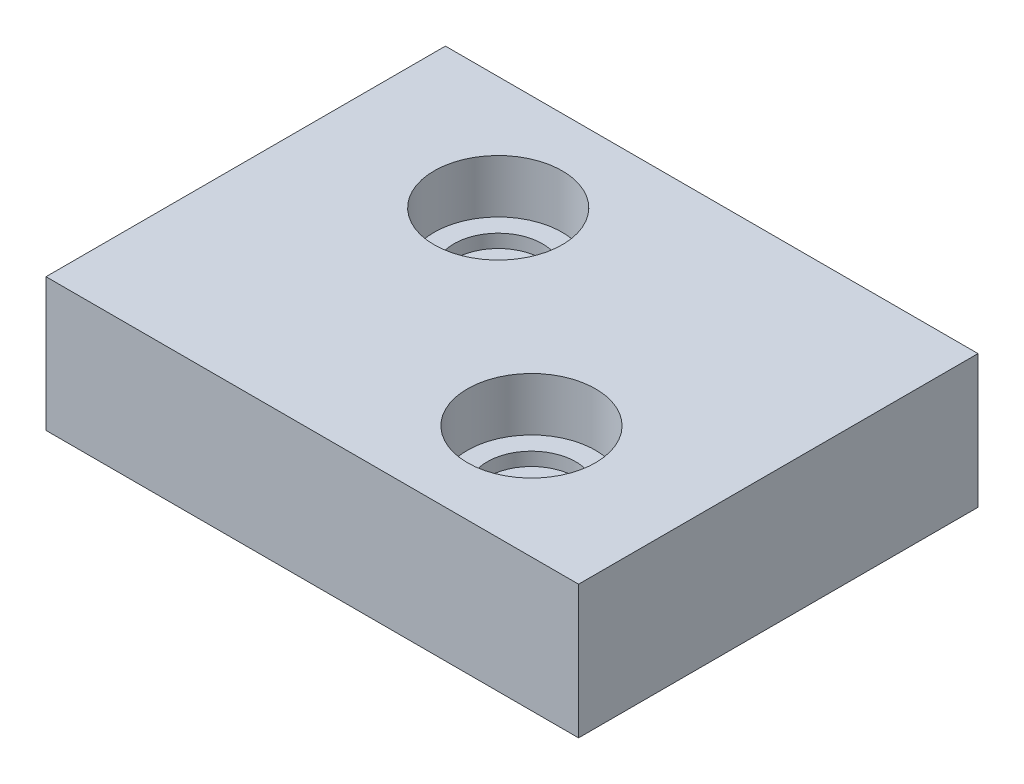
ISO-10303-21;
HEADER;
FILE_DESCRIPTION(('STEP AP214'),'2;1');
FILE_NAME('part.step','',(''),(''),'','','');
FILE_SCHEMA(('AUTOMOTIVE_DESIGN { 1 0 10303 214 1 1 1 1 }'));
ENDSEC;
DATA;
#1=APPLICATION_CONTEXT('core data for automotive mechanical design processes');
#2=APPLICATION_PROTOCOL_DEFINITION('international standard','automotive_design',2000,#1);
#3=PRODUCT_CONTEXT('',#1,'mechanical');
#4=PRODUCT('Part','Part','',(#3));
#5=PRODUCT_RELATED_PRODUCT_CATEGORY('part','',(#4));
#6=PRODUCT_DEFINITION_FORMATION('','',#4);
#7=PRODUCT_DEFINITION_CONTEXT('part definition',#1,'design');
#8=PRODUCT_DEFINITION('design','',#6,#7);
#9=PRODUCT_DEFINITION_SHAPE('','',#8);
#10=(LENGTH_UNIT() NAMED_UNIT(*) SI_UNIT(.MILLI.,.METRE.));
#11=(NAMED_UNIT(*) PLANE_ANGLE_UNIT() SI_UNIT($,.RADIAN.));
#12=(NAMED_UNIT(*) SI_UNIT($,.STERADIAN.) SOLID_ANGLE_UNIT());
#13=UNCERTAINTY_MEASURE_WITH_UNIT(LENGTH_MEASURE(1.E-05),#10,'distance_accuracy_value','');
#14=(GEOMETRIC_REPRESENTATION_CONTEXT(3) GLOBAL_UNCERTAINTY_ASSIGNED_CONTEXT((#13)) GLOBAL_UNIT_ASSIGNED_CONTEXT((#10,
#11,#12)) REPRESENTATION_CONTEXT('',''));
#15=CARTESIAN_POINT('',(0.,0.,0.));
#16=DIRECTION('',(0.,0.,1.));
#17=DIRECTION('',(1.,0.,0.));
#18=AXIS2_PLACEMENT_3D('',#15,#16,#17);
#19=CARTESIAN_POINT('',(20.,10.,15.));
#20=DIRECTION('',(-1.,0.,0.));
#21=DIRECTION('',(0.,0.,1.));
#22=AXIS2_PLACEMENT_3D('',#19,#20,#21);
#23=PLANE('',#22);
#24=DIRECTION('',(0.,0.,-1.));
#25=VECTOR('',#24,1.);
#26=CARTESIAN_POINT('',(20.,0.,15.));
#27=LINE('',#26,#25);
#28=CARTESIAN_POINT('',(20.,0.,15.));
#29=VERTEX_POINT('',#28);
#30=CARTESIAN_POINT('',(20.,0.,-15.));
#31=VERTEX_POINT('',#30);
#32=EDGE_CURVE('E111',#29,#31,#27,.T.);
#33=ORIENTED_EDGE('',*,*,#32,.T.);
#34=DIRECTION('',(0.,-1.,0.));
#35=VECTOR('',#34,1.);
#36=CARTESIAN_POINT('',(20.,10.,-15.));
#37=LINE('',#36,#35);
#38=CARTESIAN_POINT('',(20.,10.,-15.));
#39=VERTEX_POINT('',#38);
#40=EDGE_CURVE('E11',#39,#31,#37,.T.);
#41=ORIENTED_EDGE('',*,*,#40,.F.);
#42=DIRECTION('',(0.,0.,-1.));
#43=VECTOR('',#42,1.);
#44=CARTESIAN_POINT('',(20.,10.,15.));
#45=LINE('',#44,#43);
#46=CARTESIAN_POINT('',(20.,10.,15.));
#47=VERTEX_POINT('',#46);
#48=EDGE_CURVE('E95',#47,#39,#45,.T.);
#49=ORIENTED_EDGE('',*,*,#48,.F.);
#50=DIRECTION('',(0.,-1.,0.));
#51=VECTOR('',#50,1.);
#52=CARTESIAN_POINT('',(20.,10.,15.));
#53=LINE('',#52,#51);
#54=EDGE_CURVE('E107',#47,#29,#53,.T.);
#55=ORIENTED_EDGE('',*,*,#54,.T.);
#56=EDGE_LOOP('',(#33,#41,#49,#55));
#57=FACE_BOUND('',#56,.T.);
#58=ADVANCED_FACE('F43',(#57),#23,.F.);
#59=CARTESIAN_POINT('',(-20.,10.,-15.));
#60=DIRECTION('',(0.,0.,1.));
#61=DIRECTION('',(1.,0.,0.));
#62=AXIS2_PLACEMENT_3D('',#59,#60,#61);
#63=PLANE('',#62);
#64=DIRECTION('',(-1.,0.,0.));
#65=VECTOR('',#64,1.);
#66=CARTESIAN_POINT('',(-20.,0.,-15.));
#67=LINE('',#66,#65);
#68=CARTESIAN_POINT('',(-20.,0.,-15.));
#69=VERTEX_POINT('',#68);
#70=EDGE_CURVE('E100',#31,#69,#67,.T.);
#71=ORIENTED_EDGE('',*,*,#70,.T.);
#72=DIRECTION('',(0.,-1.,0.));
#73=VECTOR('',#72,1.);
#74=CARTESIAN_POINT('',(-20.,10.,-15.));
#75=LINE('',#74,#73);
#76=CARTESIAN_POINT('',(-20.,10.,-15.));
#77=VERTEX_POINT('',#76);
#78=EDGE_CURVE('E52',#77,#69,#75,.T.);
#79=ORIENTED_EDGE('',*,*,#78,.F.);
#80=DIRECTION('',(-1.,0.,0.));
#81=VECTOR('',#80,1.);
#82=CARTESIAN_POINT('',(-20.,10.,-15.));
#83=LINE('',#82,#81);
#84=EDGE_CURVE('E90',#39,#77,#83,.T.);
#85=ORIENTED_EDGE('',*,*,#84,.F.);
#86=ORIENTED_EDGE('',*,*,#40,.T.);
#87=EDGE_LOOP('',(#71,#79,#85,#86));
#88=FACE_BOUND('',#87,.T.);
#89=ADVANCED_FACE('F99',(#88),#63,.F.);
#90=CARTESIAN_POINT('',(-20.,10.,15.));
#91=DIRECTION('',(1.,0.,0.));
#92=DIRECTION('',(0.,0.,-1.));
#93=AXIS2_PLACEMENT_3D('',#90,#91,#92);
#94=PLANE('',#93);
#95=DIRECTION('',(0.,0.,1.));
#96=VECTOR('',#95,1.);
#97=CARTESIAN_POINT('',(-20.,0.,15.));
#98=LINE('',#97,#96);
#99=CARTESIAN_POINT('',(-20.,0.,15.));
#100=VERTEX_POINT('',#99);
#101=EDGE_CURVE('E77',#69,#100,#98,.T.);
#102=ORIENTED_EDGE('',*,*,#101,.T.);
#103=DIRECTION('',(0.,-1.,0.));
#104=VECTOR('',#103,1.);
#105=CARTESIAN_POINT('',(-20.,10.,15.));
#106=LINE('',#105,#104);
#107=CARTESIAN_POINT('',(-20.,10.,15.));
#108=VERTEX_POINT('',#107);
#109=EDGE_CURVE('E102',#108,#100,#106,.T.);
#110=ORIENTED_EDGE('',*,*,#109,.F.);
#111=DIRECTION('',(0.,0.,1.));
#112=VECTOR('',#111,1.);
#113=CARTESIAN_POINT('',(-20.,10.,15.));
#114=LINE('',#113,#112);
#115=EDGE_CURVE('E93',#77,#108,#114,.T.);
#116=ORIENTED_EDGE('',*,*,#115,.F.);
#117=ORIENTED_EDGE('',*,*,#78,.T.);
#118=EDGE_LOOP('',(#102,#110,#116,#117));
#119=FACE_BOUND('',#118,.T.);
#120=ADVANCED_FACE('F103',(#119),#94,.F.);
#121=CARTESIAN_POINT('',(-20.,10.,15.));
#122=DIRECTION('',(0.,0.,-1.));
#123=DIRECTION('',(-1.,0.,0.));
#124=AXIS2_PLACEMENT_3D('',#121,#122,#123);
#125=PLANE('',#124);
#126=DIRECTION('',(1.,0.,0.));
#127=VECTOR('',#126,1.);
#128=CARTESIAN_POINT('',(-20.,0.,15.));
#129=LINE('',#128,#127);
#130=EDGE_CURVE('E83',#100,#29,#129,.T.);
#131=ORIENTED_EDGE('',*,*,#130,.T.);
#132=ORIENTED_EDGE('',*,*,#54,.F.);
#133=DIRECTION('',(1.,0.,0.));
#134=VECTOR('',#133,1.);
#135=CARTESIAN_POINT('',(-20.,10.,15.));
#136=LINE('',#135,#134);
#137=EDGE_CURVE('E60',#108,#47,#136,.T.);
#138=ORIENTED_EDGE('',*,*,#137,.F.);
#139=ORIENTED_EDGE('',*,*,#109,.T.);
#140=EDGE_LOOP('',(#131,#132,#138,#139));
#141=FACE_BOUND('',#140,.T.);
#142=ADVANCED_FACE('F125',(#141),#125,.F.);
#143=CARTESIAN_POINT('',(0.,10.,0.));
#144=DIRECTION('',(0.,-1.,0.));
#145=DIRECTION('',(0.,0.,-1.));
#146=AXIS2_PLACEMENT_3D('',#143,#144,#145);
#147=PLANE('',#146);
#148=CARTESIAN_POINT('',(7.9286,10.,6.465));
#149=DIRECTION('',(0.,1.,0.));
#150=DIRECTION('',(0.,0.,1.));
#151=AXIS2_PLACEMENT_3D('',#148,#149,#150);
#152=CIRCLE('',#151,4.8125);
#153=CARTESIAN_POINT('',(7.9286,10.,11.2775));
#154=VERTEX_POINT('',#153);
#155=EDGE_CURVE('E173',#154,#154,#152,.T.);
#156=ORIENTED_EDGE('',*,*,#155,.F.);
#157=EDGE_LOOP('',(#156));
#158=FACE_BOUND('',#157,.T.);
#159=CARTESIAN_POINT('',(-7.5,10.,-6.4636));
#160=DIRECTION('',(0.,1.,0.));
#161=DIRECTION('',(0.,0.,1.));
#162=AXIS2_PLACEMENT_3D('',#159,#160,#161);
#163=CIRCLE('',#162,4.8125);
#164=CARTESIAN_POINT('',(-7.5,10.,-1.6511));
#165=VERTEX_POINT('',#164);
#166=EDGE_CURVE('E168',#165,#165,#163,.T.);
#167=ORIENTED_EDGE('',*,*,#166,.F.);
#168=EDGE_LOOP('',(#167));
#169=FACE_BOUND('',#168,.T.);
#170=ORIENTED_EDGE('',*,*,#48,.T.);
#171=ORIENTED_EDGE('',*,*,#84,.T.);
#172=ORIENTED_EDGE('',*,*,#115,.T.);
#173=ORIENTED_EDGE('',*,*,#137,.T.);
#174=EDGE_LOOP('',(#170,#171,#172,#173));
#175=FACE_BOUND('',#174,.T.);
#176=ADVANCED_FACE('F91',(#158,#169,#175),#147,.F.);
#177=CARTESIAN_POINT('',(0.,0.,0.));
#178=DIRECTION('',(0.,-1.,0.));
#179=DIRECTION('',(0.,0.,-1.));
#180=AXIS2_PLACEMENT_3D('',#177,#178,#179);
#181=PLANE('',#180);
#182=CARTESIAN_POINT('',(-13.3333333333333,0.,10.));
#183=DIRECTION('',(0.,-1.,0.));
#184=DIRECTION('',(0.,0.,1.));
#185=AXIS2_PLACEMENT_3D('',#182,#183,#184);
#186=CIRCLE('',#185,1.55);
#187=CARTESIAN_POINT('',(-13.3333333333333,0.,11.55));
#188=VERTEX_POINT('',#187);
#189=EDGE_CURVE('E136',#188,#188,#186,.T.);
#190=ORIENTED_EDGE('',*,*,#189,.F.);
#191=EDGE_LOOP('',(#190));
#192=FACE_BOUND('',#191,.T.);
#193=CARTESIAN_POINT('',(13.3333333333333,0.,-10.));
#194=DIRECTION('',(0.,-1.,0.));
#195=DIRECTION('',(0.,0.,1.));
#196=AXIS2_PLACEMENT_3D('',#193,#194,#195);
#197=CIRCLE('',#196,1.55);
#198=CARTESIAN_POINT('',(13.3333333333333,0.,-8.45));
#199=VERTEX_POINT('',#198);
#200=EDGE_CURVE('E144',#199,#199,#197,.T.);
#201=ORIENTED_EDGE('',*,*,#200,.F.);
#202=EDGE_LOOP('',(#201));
#203=FACE_BOUND('',#202,.T.);
#204=CARTESIAN_POINT('',(-13.3333333333333,0.,-9.99999999999999));
#205=DIRECTION('',(0.,-1.,0.));
#206=DIRECTION('',(0.,0.,-1.));
#207=AXIS2_PLACEMENT_3D('',#204,#205,#206);
#208=CIRCLE('',#207,1.55);
#209=CARTESIAN_POINT('',(-13.3333333333333,0.,-11.55));
#210=VERTEX_POINT('',#209);
#211=EDGE_CURVE('E145',#210,#210,#208,.T.);
#212=ORIENTED_EDGE('',*,*,#211,.F.);
#213=EDGE_LOOP('',(#212));
#214=FACE_BOUND('',#213,.T.);
#215=CARTESIAN_POINT('',(13.3333333333333,0.,10.));
#216=DIRECTION('',(0.,-1.,0.));
#217=DIRECTION('',(0.,0.,-1.));
#218=AXIS2_PLACEMENT_3D('',#215,#216,#217);
#219=CIRCLE('',#218,1.55);
#220=CARTESIAN_POINT('',(13.3333333333333,0.,8.45));
#221=VERTEX_POINT('',#220);
#222=EDGE_CURVE('E132',#221,#221,#219,.T.);
#223=ORIENTED_EDGE('',*,*,#222,.F.);
#224=EDGE_LOOP('',(#223));
#225=FACE_BOUND('',#224,.T.);
#226=ORIENTED_EDGE('',*,*,#32,.F.);
#227=ORIENTED_EDGE('',*,*,#130,.F.);
#228=ORIENTED_EDGE('',*,*,#101,.F.);
#229=ORIENTED_EDGE('',*,*,#70,.F.);
#230=EDGE_LOOP('',(#226,#227,#228,#229));
#231=FACE_BOUND('',#230,.T.);
#232=ADVANCED_FACE('F128',(#192,#203,#214,#225,#231),#181,.T.);
#233=CARTESIAN_POINT('',(13.3333333333333,4.,10.));
#234=DIRECTION('',(0.,-1.,0.));
#235=DIRECTION('',(0.,0.,-1.));
#236=AXIS2_PLACEMENT_3D('',#233,#234,#235);
#237=CYLINDRICAL_SURFACE('',#236,1.55);
#238=CARTESIAN_POINT('',(13.3333333333333,4.,10.));
#239=DIRECTION('',(0.,-1.,0.));
#240=DIRECTION('',(0.,0.,-1.));
#241=AXIS2_PLACEMENT_3D('',#238,#239,#240);
#242=CIRCLE('',#241,1.55);
#243=CARTESIAN_POINT('',(13.3333333333333,4.,8.45));
#244=VERTEX_POINT('',#243);
#245=EDGE_CURVE('E115',#244,#244,#242,.T.);
#246=ORIENTED_EDGE('',*,*,#245,.F.);
#247=EDGE_LOOP('',(#246));
#248=FACE_BOUND('',#247,.T.);
#249=ORIENTED_EDGE('',*,*,#222,.T.);
#250=EDGE_LOOP('',(#249));
#251=FACE_BOUND('',#250,.T.);
#252=ADVANCED_FACE('F249',(#248,#251),#237,.F.);
#253=CARTESIAN_POINT('',(13.3333333333333,4.,10.));
#254=DIRECTION('',(0.,-1.,0.));
#255=DIRECTION('',(0.,0.,-1.));
#256=AXIS2_PLACEMENT_3D('',#253,#254,#255);
#257=PLANE('',#256);
#258=ORIENTED_EDGE('',*,*,#245,.T.);
#259=EDGE_LOOP('',(#258));
#260=FACE_BOUND('',#259,.T.);
#261=ADVANCED_FACE('F254',(#260),#257,.T.);
#262=CARTESIAN_POINT('',(-13.3333333333333,4.,-9.99999999999999));
#263=DIRECTION('',(0.,-1.,0.));
#264=DIRECTION('',(0.,0.,-1.));
#265=AXIS2_PLACEMENT_3D('',#262,#263,#264);
#266=CYLINDRICAL_SURFACE('',#265,1.55);
#267=CARTESIAN_POINT('',(-13.3333333333333,4.,-9.99999999999999));
#268=DIRECTION('',(0.,-1.,0.));
#269=DIRECTION('',(0.,0.,-1.));
#270=AXIS2_PLACEMENT_3D('',#267,#268,#269);
#271=CIRCLE('',#270,1.55);
#272=CARTESIAN_POINT('',(-13.3333333333333,4.,-11.55));
#273=VERTEX_POINT('',#272);
#274=EDGE_CURVE('E156',#273,#273,#271,.T.);
#275=ORIENTED_EDGE('',*,*,#274,.F.);
#276=EDGE_LOOP('',(#275));
#277=FACE_BOUND('',#276,.T.);
#278=ORIENTED_EDGE('',*,*,#211,.T.);
#279=EDGE_LOOP('',(#278));
#280=FACE_BOUND('',#279,.T.);
#281=ADVANCED_FACE('F258',(#277,#280),#266,.F.);
#282=CARTESIAN_POINT('',(-13.3333333333333,4.,-9.99999999999999));
#283=DIRECTION('',(0.,-1.,0.));
#284=DIRECTION('',(0.,0.,-1.));
#285=AXIS2_PLACEMENT_3D('',#282,#283,#284);
#286=PLANE('',#285);
#287=ORIENTED_EDGE('',*,*,#274,.T.);
#288=EDGE_LOOP('',(#287));
#289=FACE_BOUND('',#288,.T.);
#290=ADVANCED_FACE('F266',(#289),#286,.T.);
#291=CARTESIAN_POINT('',(13.3333333333333,4.,-10.));
#292=DIRECTION('',(0.,-1.,0.));
#293=DIRECTION('',(0.,0.,-1.));
#294=AXIS2_PLACEMENT_3D('',#291,#292,#293);
#295=CYLINDRICAL_SURFACE('',#294,1.55);
#296=CARTESIAN_POINT('',(13.3333333333333,4.,-10.));
#297=DIRECTION('',(0.,-1.,0.));
#298=DIRECTION('',(0.,0.,1.));
#299=AXIS2_PLACEMENT_3D('',#296,#297,#298);
#300=CIRCLE('',#299,1.55);
#301=CARTESIAN_POINT('',(13.3333333333333,4.,-8.45));
#302=VERTEX_POINT('',#301);
#303=EDGE_CURVE('E140',#302,#302,#300,.T.);
#304=ORIENTED_EDGE('',*,*,#303,.F.);
#305=EDGE_LOOP('',(#304));
#306=FACE_BOUND('',#305,.T.);
#307=ORIENTED_EDGE('',*,*,#200,.T.);
#308=EDGE_LOOP('',(#307));
#309=FACE_BOUND('',#308,.T.);
#310=ADVANCED_FACE('F263',(#306,#309),#295,.F.);
#311=CARTESIAN_POINT('',(13.3333333333333,4.,-10.));
#312=DIRECTION('',(0.,1.,0.));
#313=DIRECTION('',(0.,0.,1.));
#314=AXIS2_PLACEMENT_3D('',#311,#312,#313);
#315=PLANE('',#314);
#316=ORIENTED_EDGE('',*,*,#303,.T.);
#317=EDGE_LOOP('',(#316));
#318=FACE_BOUND('',#317,.T.);
#319=ADVANCED_FACE('F260',(#318),#315,.F.);
#320=CARTESIAN_POINT('',(-13.3333333333333,4.,10.));
#321=DIRECTION('',(0.,-1.,0.));
#322=DIRECTION('',(0.,0.,-1.));
#323=AXIS2_PLACEMENT_3D('',#320,#321,#322);
#324=CYLINDRICAL_SURFACE('',#323,1.55);
#325=CARTESIAN_POINT('',(-13.3333333333333,4.,10.));
#326=DIRECTION('',(0.,-1.,0.));
#327=DIRECTION('',(0.,0.,1.));
#328=AXIS2_PLACEMENT_3D('',#325,#326,#327);
#329=CIRCLE('',#328,1.55);
#330=CARTESIAN_POINT('',(-13.3333333333333,4.,11.55));
#331=VERTEX_POINT('',#330);
#332=EDGE_CURVE('E149',#331,#331,#329,.T.);
#333=ORIENTED_EDGE('',*,*,#332,.F.);
#334=EDGE_LOOP('',(#333));
#335=FACE_BOUND('',#334,.T.);
#336=ORIENTED_EDGE('',*,*,#189,.T.);
#337=EDGE_LOOP('',(#336));
#338=FACE_BOUND('',#337,.T.);
#339=ADVANCED_FACE('F233',(#335,#338),#324,.F.);
#340=CARTESIAN_POINT('',(-13.3333333333333,4.,10.));
#341=DIRECTION('',(0.,1.,0.));
#342=DIRECTION('',(0.,0.,1.));
#343=AXIS2_PLACEMENT_3D('',#340,#341,#342);
#344=PLANE('',#343);
#345=ORIENTED_EDGE('',*,*,#332,.T.);
#346=EDGE_LOOP('',(#345));
#347=FACE_BOUND('',#346,.T.);
#348=ADVANCED_FACE('F224',(#347),#344,.F.);
#349=CARTESIAN_POINT('',(-7.5,6.,-6.4636));
#350=DIRECTION('',(0.,1.,0.));
#351=DIRECTION('',(0.,0.,1.));
#352=AXIS2_PLACEMENT_3D('',#349,#350,#351);
#353=CYLINDRICAL_SURFACE('',#352,4.8125);
#354=CARTESIAN_POINT('',(-7.5,6.,-6.4636));
#355=DIRECTION('',(0.,1.,0.));
#356=DIRECTION('',(0.,0.,1.));
#357=AXIS2_PLACEMENT_3D('',#354,#355,#356);
#358=CIRCLE('',#357,4.8125);
#359=CARTESIAN_POINT('',(-7.5,6.,-1.6511));
#360=VERTEX_POINT('',#359);
#361=EDGE_CURVE('E164',#360,#360,#358,.T.);
#362=ORIENTED_EDGE('',*,*,#361,.F.);
#363=EDGE_LOOP('',(#362));
#364=FACE_BOUND('',#363,.T.);
#365=ORIENTED_EDGE('',*,*,#166,.T.);
#366=EDGE_LOOP('',(#365));
#367=FACE_BOUND('',#366,.T.);
#368=ADVANCED_FACE('F222',(#364,#367),#353,.F.);
#369=CARTESIAN_POINT('',(-7.5,6.,-6.4636));
#370=DIRECTION('',(0.,1.,0.));
#371=DIRECTION('',(0.,0.,1.));
#372=AXIS2_PLACEMENT_3D('',#369,#370,#371);
#373=PLANE('',#372);
#374=CARTESIAN_POINT('',(-7.5,6.,-6.4636));
#375=DIRECTION('',(0.,1.,0.));
#376=DIRECTION('',(0.,0.,1.));
#377=AXIS2_PLACEMENT_3D('',#374,#375,#376);
#378=CIRCLE('',#377,3.325);
#379=CARTESIAN_POINT('',(-7.5,6.,-3.1386));
#380=VERTEX_POINT('',#379);
#381=EDGE_CURVE('E184',#380,#380,#378,.T.);
#382=ORIENTED_EDGE('',*,*,#381,.F.);
#383=EDGE_LOOP('',(#382));
#384=FACE_BOUND('',#383,.T.);
#385=ORIENTED_EDGE('',*,*,#361,.T.);
#386=EDGE_LOOP('',(#385));
#387=FACE_BOUND('',#386,.T.);
#388=ADVANCED_FACE('F213',(#384,#387),#373,.T.);
#389=CARTESIAN_POINT('',(7.9286,6.,6.465));
#390=DIRECTION('',(0.,1.,0.));
#391=DIRECTION('',(0.,0.,1.));
#392=AXIS2_PLACEMENT_3D('',#389,#390,#391);
#393=CYLINDRICAL_SURFACE('',#392,4.8125);
#394=CARTESIAN_POINT('',(7.9286,6.,6.465));
#395=DIRECTION('',(0.,1.,0.));
#396=DIRECTION('',(0.,0.,1.));
#397=AXIS2_PLACEMENT_3D('',#394,#395,#396);
#398=CIRCLE('',#397,4.8125);
#399=CARTESIAN_POINT('',(7.9286,6.,11.2775));
#400=VERTEX_POINT('',#399);
#401=EDGE_CURVE('E160',#400,#400,#398,.T.);
#402=ORIENTED_EDGE('',*,*,#401,.F.);
#403=EDGE_LOOP('',(#402));
#404=FACE_BOUND('',#403,.T.);
#405=ORIENTED_EDGE('',*,*,#155,.T.);
#406=EDGE_LOOP('',(#405));
#407=FACE_BOUND('',#406,.T.);
#408=ADVANCED_FACE('F207',(#404,#407),#393,.F.);
#409=CARTESIAN_POINT('',(7.9286,6.,6.465));
#410=DIRECTION('',(0.,1.,0.));
#411=DIRECTION('',(0.,0.,1.));
#412=AXIS2_PLACEMENT_3D('',#409,#410,#411);
#413=PLANE('',#412);
#414=CARTESIAN_POINT('',(7.9286,6.,6.465));
#415=DIRECTION('',(0.,1.,0.));
#416=DIRECTION('',(0.,0.,1.));
#417=AXIS2_PLACEMENT_3D('',#414,#415,#416);
#418=CIRCLE('',#417,3.325);
#419=CARTESIAN_POINT('',(7.9286,6.,9.79));
#420=VERTEX_POINT('',#419);
#421=EDGE_CURVE('E188',#420,#420,#418,.T.);
#422=ORIENTED_EDGE('',*,*,#421,.F.);
#423=EDGE_LOOP('',(#422));
#424=FACE_BOUND('',#423,.T.);
#425=ORIENTED_EDGE('',*,*,#401,.T.);
#426=EDGE_LOOP('',(#425));
#427=FACE_BOUND('',#426,.T.);
#428=ADVANCED_FACE('F201',(#424,#427),#413,.T.);
#429=CARTESIAN_POINT('',(7.9286,5.,6.465));
#430=DIRECTION('',(0.,1.,0.));
#431=DIRECTION('',(0.,0.,1.));
#432=AXIS2_PLACEMENT_3D('',#429,#430,#431);
#433=CYLINDRICAL_SURFACE('',#432,3.325);
#434=CARTESIAN_POINT('',(7.9286,5.,6.465));
#435=DIRECTION('',(0.,1.,0.));
#436=DIRECTION('',(0.,0.,1.));
#437=AXIS2_PLACEMENT_3D('',#434,#435,#436);
#438=CIRCLE('',#437,3.325);
#439=CARTESIAN_POINT('',(7.9286,5.,9.79));
#440=VERTEX_POINT('',#439);
#441=EDGE_CURVE('E169',#440,#440,#438,.T.);
#442=ORIENTED_EDGE('',*,*,#441,.F.);
#443=EDGE_LOOP('',(#442));
#444=FACE_BOUND('',#443,.T.);
#445=ORIENTED_EDGE('',*,*,#421,.T.);
#446=EDGE_LOOP('',(#445));
#447=FACE_BOUND('',#446,.T.);
#448=ADVANCED_FACE('F198',(#444,#447),#433,.F.);
#449=CARTESIAN_POINT('',(7.9286,5.,6.465));
#450=DIRECTION('',(0.,1.,0.));
#451=DIRECTION('',(0.,0.,1.));
#452=AXIS2_PLACEMENT_3D('',#449,#450,#451);
#453=PLANE('',#452);
#454=ORIENTED_EDGE('',*,*,#441,.T.);
#455=EDGE_LOOP('',(#454));
#456=FACE_BOUND('',#455,.T.);
#457=ADVANCED_FACE('F196',(#456),#453,.T.);
#458=CARTESIAN_POINT('',(-7.5,5.,-6.4636));
#459=DIRECTION('',(0.,1.,0.));
#460=DIRECTION('',(0.,0.,1.));
#461=AXIS2_PLACEMENT_3D('',#458,#459,#460);
#462=CYLINDRICAL_SURFACE('',#461,3.325);
#463=CARTESIAN_POINT('',(-7.5,5.,-6.4636));
#464=DIRECTION('',(0.,1.,0.));
#465=DIRECTION('',(0.,0.,1.));
#466=AXIS2_PLACEMENT_3D('',#463,#464,#465);
#467=CIRCLE('',#466,3.325);
#468=CARTESIAN_POINT('',(-7.5,5.,-3.1386));
#469=VERTEX_POINT('',#468);
#470=EDGE_CURVE('E180',#469,#469,#467,.T.);
#471=ORIENTED_EDGE('',*,*,#470,.F.);
#472=EDGE_LOOP('',(#471));
#473=FACE_BOUND('',#472,.T.);
#474=ORIENTED_EDGE('',*,*,#381,.T.);
#475=EDGE_LOOP('',(#474));
#476=FACE_BOUND('',#475,.T.);
#477=ADVANCED_FACE('F360',(#473,#476),#462,.F.);
#478=CARTESIAN_POINT('',(-7.5,5.,-6.4636));
#479=DIRECTION('',(0.,1.,0.));
#480=DIRECTION('',(0.,0.,1.));
#481=AXIS2_PLACEMENT_3D('',#478,#479,#480);
#482=PLANE('',#481);
#483=ORIENTED_EDGE('',*,*,#470,.T.);
#484=EDGE_LOOP('',(#483));
#485=FACE_BOUND('',#484,.T.);
#486=ADVANCED_FACE('F370',(#485),#482,.T.);
#487=CLOSED_SHELL('',(#58,#89,#120,#142,#176,#232,#252,#261,#281,#290,#310,#319,#339,#348,#368,
#388,#408,#428,#448,#457,#477,#486));
#488=MANIFOLD_SOLID_BREP('B2',#487);
#489=ADVANCED_BREP_SHAPE_REPRESENTATION('',(#18,#488),#14);
#490=SHAPE_DEFINITION_REPRESENTATION(#9,#489);
ENDSEC;
END-ISO-10303-21;
